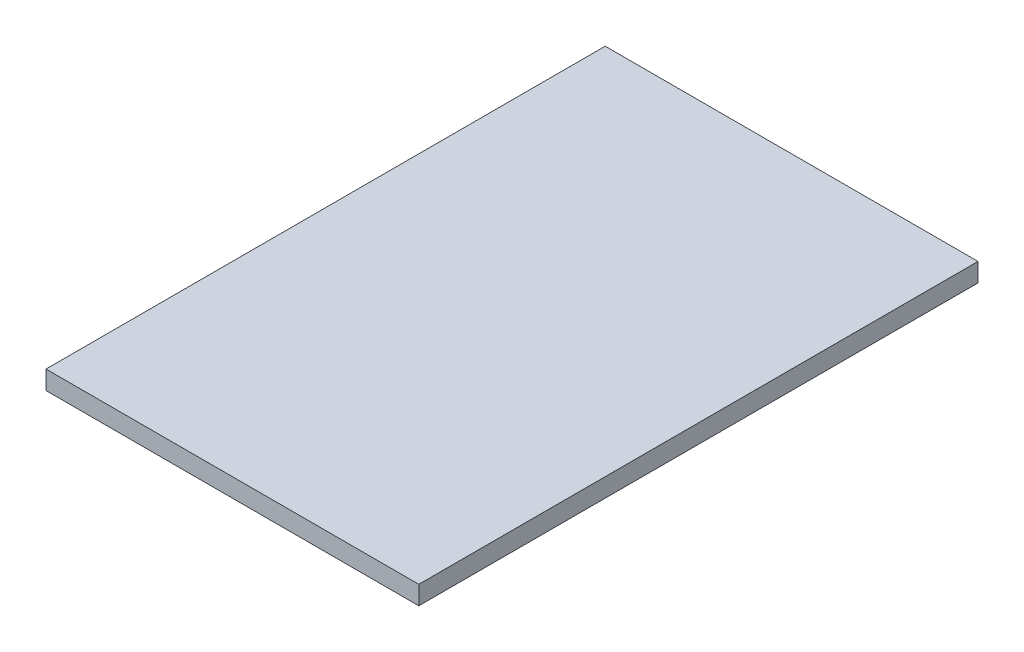
ISO-10303-21;
HEADER;
FILE_DESCRIPTION(('STEP AP214'),'2;1');
FILE_NAME('part.step','',(''),(''),'','','');
FILE_SCHEMA(('AUTOMOTIVE_DESIGN { 1 0 10303 214 1 1 1 1 }'));
ENDSEC;
DATA;
#1=APPLICATION_CONTEXT('core data for automotive mechanical design processes');
#2=APPLICATION_PROTOCOL_DEFINITION('international standard','automotive_design',2000,#1);
#3=PRODUCT_CONTEXT('',#1,'mechanical');
#4=PRODUCT('Part','Part','',(#3));
#5=PRODUCT_RELATED_PRODUCT_CATEGORY('part','',(#4));
#6=PRODUCT_DEFINITION_FORMATION('','',#4);
#7=PRODUCT_DEFINITION_CONTEXT('part definition',#1,'design');
#8=PRODUCT_DEFINITION('design','',#6,#7);
#9=PRODUCT_DEFINITION_SHAPE('','',#8);
#10=(LENGTH_UNIT() NAMED_UNIT(*) SI_UNIT(.MILLI.,.METRE.));
#11=(NAMED_UNIT(*) PLANE_ANGLE_UNIT() SI_UNIT($,.RADIAN.));
#12=(NAMED_UNIT(*) SI_UNIT($,.STERADIAN.) SOLID_ANGLE_UNIT());
#13=UNCERTAINTY_MEASURE_WITH_UNIT(LENGTH_MEASURE(1.E-05),#10,'distance_accuracy_value','');
#14=(GEOMETRIC_REPRESENTATION_CONTEXT(3) GLOBAL_UNCERTAINTY_ASSIGNED_CONTEXT((#13)) GLOBAL_UNIT_ASSIGNED_CONTEXT((#10,
#11,#12)) REPRESENTATION_CONTEXT('',''));
#15=CARTESIAN_POINT('',(0.,0.,0.));
#16=DIRECTION('',(0.,0.,1.));
#17=DIRECTION('',(1.,0.,0.));
#18=AXIS2_PLACEMENT_3D('',#15,#16,#17);
#19=CARTESIAN_POINT('',(100.,10.,150.));
#20=DIRECTION('',(-1.,0.,0.));
#21=DIRECTION('',(0.,0.,1.));
#22=AXIS2_PLACEMENT_3D('',#19,#20,#21);
#23=PLANE('',#22);
#24=DIRECTION('',(0.,0.,-1.));
#25=VECTOR('',#24,1.);
#26=CARTESIAN_POINT('',(100.,0.,150.));
#27=LINE('',#26,#25);
#28=CARTESIAN_POINT('',(100.,0.,150.));
#29=VERTEX_POINT('',#28);
#30=CARTESIAN_POINT('',(100.,0.,-150.));
#31=VERTEX_POINT('',#30);
#32=EDGE_CURVE('E106',#29,#31,#27,.T.);
#33=ORIENTED_EDGE('',*,*,#32,.T.);
#34=DIRECTION('',(0.,-1.,0.));
#35=VECTOR('',#34,1.);
#36=CARTESIAN_POINT('',(100.,10.,-150.));
#37=LINE('',#36,#35);
#38=CARTESIAN_POINT('',(100.,10.,-150.));
#39=VERTEX_POINT('',#38);
#40=EDGE_CURVE('E11',#39,#31,#37,.T.);
#41=ORIENTED_EDGE('',*,*,#40,.F.);
#42=DIRECTION('',(0.,0.,-1.));
#43=VECTOR('',#42,1.);
#44=CARTESIAN_POINT('',(100.,10.,150.));
#45=LINE('',#44,#43);
#46=CARTESIAN_POINT('',(100.,10.,150.));
#47=VERTEX_POINT('',#46);
#48=EDGE_CURVE('E94',#47,#39,#45,.T.);
#49=ORIENTED_EDGE('',*,*,#48,.F.);
#50=DIRECTION('',(0.,-1.,0.));
#51=VECTOR('',#50,1.);
#52=CARTESIAN_POINT('',(100.,10.,150.));
#53=LINE('',#52,#51);
#54=EDGE_CURVE('E102',#47,#29,#53,.T.);
#55=ORIENTED_EDGE('',*,*,#54,.T.);
#56=EDGE_LOOP('',(#33,#41,#49,#55));
#57=FACE_BOUND('',#56,.T.);
#58=ADVANCED_FACE('F43',(#57),#23,.F.);
#59=CARTESIAN_POINT('',(-100.,10.,-150.));
#60=DIRECTION('',(0.,0.,1.));
#61=DIRECTION('',(1.,0.,0.));
#62=AXIS2_PLACEMENT_3D('',#59,#60,#61);
#63=PLANE('',#62);
#64=DIRECTION('',(-1.,0.,0.));
#65=VECTOR('',#64,1.);
#66=CARTESIAN_POINT('',(-100.,0.,-150.));
#67=LINE('',#66,#65);
#68=CARTESIAN_POINT('',(-100.,0.,-150.));
#69=VERTEX_POINT('',#68);
#70=EDGE_CURVE('E98',#31,#69,#67,.T.);
#71=ORIENTED_EDGE('',*,*,#70,.T.);
#72=DIRECTION('',(0.,-1.,0.));
#73=VECTOR('',#72,1.);
#74=CARTESIAN_POINT('',(-100.,10.,-150.));
#75=LINE('',#74,#73);
#76=CARTESIAN_POINT('',(-100.,10.,-150.));
#77=VERTEX_POINT('',#76);
#78=EDGE_CURVE('E51',#77,#69,#75,.T.);
#79=ORIENTED_EDGE('',*,*,#78,.F.);
#80=DIRECTION('',(-1.,0.,0.));
#81=VECTOR('',#80,1.);
#82=CARTESIAN_POINT('',(-100.,10.,-150.));
#83=LINE('',#82,#81);
#84=EDGE_CURVE('E89',#39,#77,#83,.T.);
#85=ORIENTED_EDGE('',*,*,#84,.F.);
#86=ORIENTED_EDGE('',*,*,#40,.T.);
#87=EDGE_LOOP('',(#71,#79,#85,#86));
#88=FACE_BOUND('',#87,.T.);
#89=ADVANCED_FACE('F97',(#88),#63,.F.);
#90=CARTESIAN_POINT('',(-100.,10.,150.));
#91=DIRECTION('',(1.,0.,0.));
#92=DIRECTION('',(0.,0.,-1.));
#93=AXIS2_PLACEMENT_3D('',#90,#91,#92);
#94=PLANE('',#93);
#95=DIRECTION('',(0.,0.,1.));
#96=VECTOR('',#95,1.);
#97=CARTESIAN_POINT('',(-100.,0.,150.));
#98=LINE('',#97,#96);
#99=CARTESIAN_POINT('',(-100.,0.,150.));
#100=VERTEX_POINT('',#99);
#101=EDGE_CURVE('E76',#69,#100,#98,.T.);
#102=ORIENTED_EDGE('',*,*,#101,.T.);
#103=DIRECTION('',(0.,-1.,0.));
#104=VECTOR('',#103,1.);
#105=CARTESIAN_POINT('',(-100.,10.,150.));
#106=LINE('',#105,#104);
#107=CARTESIAN_POINT('',(-100.,10.,150.));
#108=VERTEX_POINT('',#107);
#109=EDGE_CURVE('E99',#108,#100,#106,.T.);
#110=ORIENTED_EDGE('',*,*,#109,.F.);
#111=DIRECTION('',(0.,0.,1.));
#112=VECTOR('',#111,1.);
#113=CARTESIAN_POINT('',(-100.,10.,150.));
#114=LINE('',#113,#112);
#115=EDGE_CURVE('E92',#77,#108,#114,.T.);
#116=ORIENTED_EDGE('',*,*,#115,.F.);
#117=ORIENTED_EDGE('',*,*,#78,.T.);
#118=EDGE_LOOP('',(#102,#110,#116,#117));
#119=FACE_BOUND('',#118,.T.);
#120=ADVANCED_FACE('F100',(#119),#94,.F.);
#121=CARTESIAN_POINT('',(-100.,10.,150.));
#122=DIRECTION('',(0.,0.,-1.));
#123=DIRECTION('',(-1.,0.,0.));
#124=AXIS2_PLACEMENT_3D('',#121,#122,#123);
#125=PLANE('',#124);
#126=DIRECTION('',(1.,0.,0.));
#127=VECTOR('',#126,1.);
#128=CARTESIAN_POINT('',(-100.,0.,150.));
#129=LINE('',#128,#127);
#130=EDGE_CURVE('E82',#100,#29,#129,.T.);
#131=ORIENTED_EDGE('',*,*,#130,.T.);
#132=ORIENTED_EDGE('',*,*,#54,.F.);
#133=DIRECTION('',(1.,0.,0.));
#134=VECTOR('',#133,1.);
#135=CARTESIAN_POINT('',(-100.,10.,150.));
#136=LINE('',#135,#134);
#137=EDGE_CURVE('E59',#108,#47,#136,.T.);
#138=ORIENTED_EDGE('',*,*,#137,.F.);
#139=ORIENTED_EDGE('',*,*,#109,.T.);
#140=EDGE_LOOP('',(#131,#132,#138,#139));
#141=FACE_BOUND('',#140,.T.);
#142=ADVANCED_FACE('F113',(#141),#125,.F.);
#143=CARTESIAN_POINT('',(0.,10.,0.));
#144=DIRECTION('',(0.,-1.,0.));
#145=DIRECTION('',(0.,0.,-1.));
#146=AXIS2_PLACEMENT_3D('',#143,#144,#145);
#147=PLANE('',#146);
#148=ORIENTED_EDGE('',*,*,#48,.T.);
#149=ORIENTED_EDGE('',*,*,#84,.T.);
#150=ORIENTED_EDGE('',*,*,#115,.T.);
#151=ORIENTED_EDGE('',*,*,#137,.T.);
#152=EDGE_LOOP('',(#148,#149,#150,#151));
#153=FACE_BOUND('',#152,.T.);
#154=ADVANCED_FACE('F90',(#153),#147,.F.);
#155=CARTESIAN_POINT('',(0.,0.,0.));
#156=DIRECTION('',(0.,-1.,0.));
#157=DIRECTION('',(0.,0.,-1.));
#158=AXIS2_PLACEMENT_3D('',#155,#156,#157);
#159=PLANE('',#158);
#160=ORIENTED_EDGE('',*,*,#32,.F.);
#161=ORIENTED_EDGE('',*,*,#130,.F.);
#162=ORIENTED_EDGE('',*,*,#101,.F.);
#163=ORIENTED_EDGE('',*,*,#70,.F.);
#164=EDGE_LOOP('',(#160,#161,#162,#163));
#165=FACE_BOUND('',#164,.T.);
#166=ADVANCED_FACE('F116',(#165),#159,.T.);
#167=CLOSED_SHELL('',(#58,#89,#120,#142,#154,#166));
#168=MANIFOLD_SOLID_BREP('B2',#167);
#169=ADVANCED_BREP_SHAPE_REPRESENTATION('',(#18,#168),#14);
#170=SHAPE_DEFINITION_REPRESENTATION(#9,#169);
ENDSEC;
END-ISO-10303-21;
